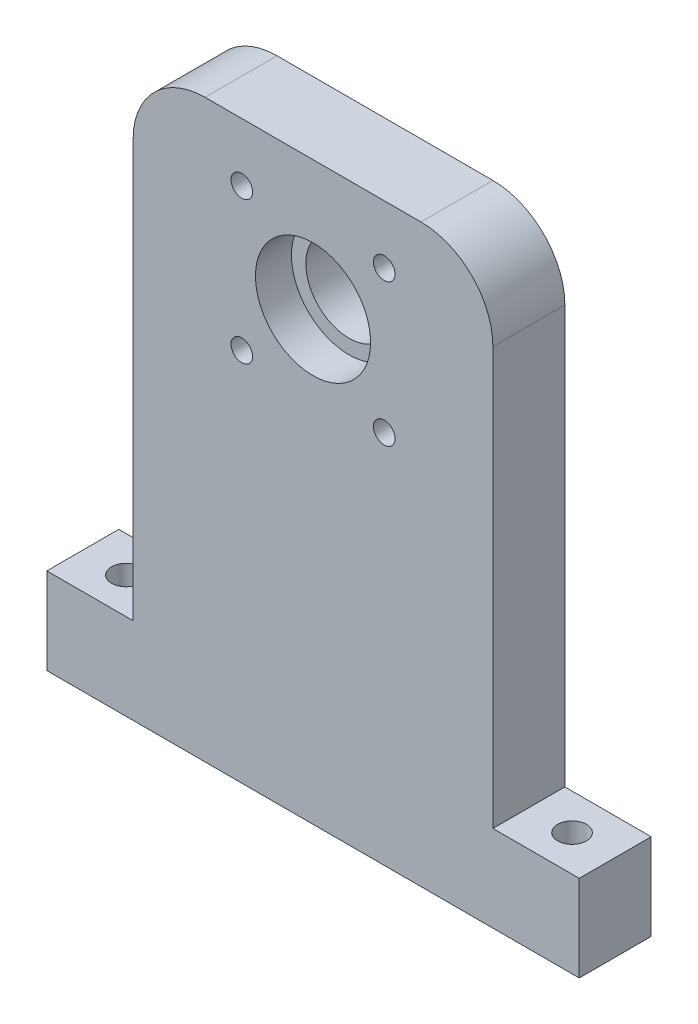
ISO-10303-21;
HEADER;
FILE_DESCRIPTION(('STEP AP214'),'2;1');
FILE_NAME('part.step','',(''),(''),'','','');
FILE_SCHEMA(('AUTOMOTIVE_DESIGN { 1 0 10303 214 1 1 1 1 }'));
ENDSEC;
DATA;
#1=APPLICATION_CONTEXT('core data for automotive mechanical design processes');
#2=APPLICATION_PROTOCOL_DEFINITION('international standard','automotive_design',2000,#1);
#3=PRODUCT_CONTEXT('',#1,'mechanical');
#4=PRODUCT('Part','Part','',(#3));
#5=PRODUCT_RELATED_PRODUCT_CATEGORY('part','',(#4));
#6=PRODUCT_DEFINITION_FORMATION('','',#4);
#7=PRODUCT_DEFINITION_CONTEXT('part definition',#1,'design');
#8=PRODUCT_DEFINITION('design','',#6,#7);
#9=PRODUCT_DEFINITION_SHAPE('','',#8);
#10=(LENGTH_UNIT() NAMED_UNIT(*) SI_UNIT(.MILLI.,.METRE.));
#11=(NAMED_UNIT(*) PLANE_ANGLE_UNIT() SI_UNIT($,.RADIAN.));
#12=(NAMED_UNIT(*) SI_UNIT($,.STERADIAN.) SOLID_ANGLE_UNIT());
#13=UNCERTAINTY_MEASURE_WITH_UNIT(LENGTH_MEASURE(1.E-05),#10,'distance_accuracy_value','');
#14=(GEOMETRIC_REPRESENTATION_CONTEXT(3) GLOBAL_UNCERTAINTY_ASSIGNED_CONTEXT((#13)) GLOBAL_UNIT_ASSIGNED_CONTEXT((#10,
#11,#12)) REPRESENTATION_CONTEXT('',''));
#15=CARTESIAN_POINT('',(0.,0.,0.));
#16=DIRECTION('',(0.,0.,1.));
#17=DIRECTION('',(1.,0.,0.));
#18=AXIS2_PLACEMENT_3D('',#15,#16,#17);
#19=CARTESIAN_POINT('',(24.3750000000001,56.,10.));
#20=DIRECTION('',(0.,-1.,0.));
#21=DIRECTION('',(1.,0.,0.));
#22=AXIS2_PLACEMENT_3D('',#19,#20,#21);
#23=PLANE('',#22);
#24=DIRECTION('',(-1.,0.,0.));
#25=VECTOR('',#24,1.);
#26=CARTESIAN_POINT('',(24.3750000000001,56.,0.));
#27=LINE('',#26,#25);
#28=CARTESIAN_POINT('',(14.3750000000001,56.,0.));
#29=VERTEX_POINT('',#28);
#30=CARTESIAN_POINT('',(-15.6249999999999,56.,0.));
#31=VERTEX_POINT('',#30);
#32=EDGE_CURVE('E151',#29,#31,#27,.T.);
#33=ORIENTED_EDGE('',*,*,#32,.T.);
#34=DIRECTION('',(0.,0.,-1.));
#35=VECTOR('',#34,1.);
#36=CARTESIAN_POINT('',(-15.6249999999999,56.,10.));
#37=LINE('',#36,#35);
#38=CARTESIAN_POINT('',(-15.6249999999999,56.,10.));
#39=VERTEX_POINT('',#38);
#40=EDGE_CURVE('E55',#31,#39,#37,.F.);
#41=ORIENTED_EDGE('',*,*,#40,.T.);
#42=DIRECTION('',(-1.,0.,0.));
#43=VECTOR('',#42,1.);
#44=CARTESIAN_POINT('',(24.3750000000001,56.,10.));
#45=LINE('',#44,#43);
#46=CARTESIAN_POINT('',(14.3750000000001,56.,10.));
#47=VERTEX_POINT('',#46);
#48=EDGE_CURVE('E122',#47,#39,#45,.T.);
#49=ORIENTED_EDGE('',*,*,#48,.F.);
#50=DIRECTION('',(0.,0.,-1.));
#51=VECTOR('',#50,1.);
#52=CARTESIAN_POINT('',(14.3750000000001,56.,10.));
#53=LINE('',#52,#51);
#54=EDGE_CURVE('E184',#47,#29,#53,.T.);
#55=ORIENTED_EDGE('',*,*,#54,.T.);
#56=EDGE_LOOP('',(#33,#41,#49,#55));
#57=FACE_BOUND('',#56,.T.);
#58=ADVANCED_FACE('F32',(#57),#23,.F.);
#59=CARTESIAN_POINT('',(-25.6249999999999,56.,10.));
#60=DIRECTION('',(1.,0.,0.));
#61=DIRECTION('',(0.,1.,0.));
#62=AXIS2_PLACEMENT_3D('',#59,#60,#61);
#63=PLANE('',#62);
#64=DIRECTION('',(0.,-1.,0.));
#65=VECTOR('',#64,1.);
#66=CARTESIAN_POINT('',(-25.6249999999999,56.,10.));
#67=LINE('',#66,#65);
#68=CARTESIAN_POINT('',(-25.6249999999999,46.,10.));
#69=VERTEX_POINT('',#68);
#70=CARTESIAN_POINT('',(-25.6249999999999,-12.,10.));
#71=VERTEX_POINT('',#70);
#72=EDGE_CURVE('E112',#69,#71,#67,.T.);
#73=ORIENTED_EDGE('',*,*,#72,.F.);
#74=DIRECTION('',(0.,0.,-1.));
#75=VECTOR('',#74,1.);
#76=CARTESIAN_POINT('',(-25.6249999999999,46.,10.));
#77=LINE('',#76,#75);
#78=CARTESIAN_POINT('',(-25.6249999999999,46.,0.));
#79=VERTEX_POINT('',#78);
#80=EDGE_CURVE('E131',#69,#79,#77,.T.);
#81=ORIENTED_EDGE('',*,*,#80,.T.);
#82=DIRECTION('',(0.,-1.,0.));
#83=VECTOR('',#82,1.);
#84=CARTESIAN_POINT('',(-25.6249999999999,56.,0.));
#85=LINE('',#84,#83);
#86=CARTESIAN_POINT('',(-25.6249999999999,-12.,0.));
#87=VERTEX_POINT('',#86);
#88=EDGE_CURVE('E128',#79,#87,#85,.T.);
#89=ORIENTED_EDGE('',*,*,#88,.T.);
#90=DIRECTION('',(0.,0.,-1.));
#91=VECTOR('',#90,1.);
#92=CARTESIAN_POINT('',(-25.6249999999999,-12.,10.));
#93=LINE('',#92,#91);
#94=EDGE_CURVE('E125',#71,#87,#93,.T.);
#95=ORIENTED_EDGE('',*,*,#94,.F.);
#96=EDGE_LOOP('',(#73,#81,#89,#95));
#97=FACE_BOUND('',#96,.T.);
#98=ADVANCED_FACE('F126',(#97),#63,.F.);
#99=CARTESIAN_POINT('',(-25.6249999999999,-12.,10.));
#100=DIRECTION('',(0.,-1.,0.));
#101=DIRECTION('',(1.,0.,0.));
#102=AXIS2_PLACEMENT_3D('',#99,#100,#101);
#103=PLANE('',#102);
#104=CARTESIAN_POINT('',(-31.6249999999999,-12.,5.));
#105=DIRECTION('',(0.,1.,0.));
#106=DIRECTION('',(0.,0.,1.));
#107=AXIS2_PLACEMENT_3D('',#104,#105,#106);
#108=CIRCLE('',#107,2.00000000000001);
#109=CARTESIAN_POINT('',(-31.6249999999999,-12.,7.00000000000001));
#110=VERTEX_POINT('',#109);
#111=EDGE_CURVE('E193',#110,#110,#108,.T.);
#112=ORIENTED_EDGE('',*,*,#111,.F.);
#113=EDGE_LOOP('',(#112));
#114=FACE_BOUND('',#113,.T.);
#115=DIRECTION('',(-1.,0.,0.));
#116=VECTOR('',#115,1.);
#117=CARTESIAN_POINT('',(-25.6249999999999,-12.,0.));
#118=LINE('',#117,#116);
#119=CARTESIAN_POINT('',(-37.6249999999999,-12.,0.));
#120=VERTEX_POINT('',#119);
#121=EDGE_CURVE('E155',#87,#120,#118,.T.);
#122=ORIENTED_EDGE('',*,*,#121,.T.);
#123=DIRECTION('',(0.,0.,-1.));
#124=VECTOR('',#123,1.);
#125=CARTESIAN_POINT('',(-37.6249999999999,-12.,10.));
#126=LINE('',#125,#124);
#127=CARTESIAN_POINT('',(-37.6249999999999,-12.,10.));
#128=VERTEX_POINT('',#127);
#129=EDGE_CURVE('E132',#128,#120,#126,.T.);
#130=ORIENTED_EDGE('',*,*,#129,.F.);
#131=DIRECTION('',(-1.,0.,0.));
#132=VECTOR('',#131,1.);
#133=CARTESIAN_POINT('',(-25.6249999999999,-12.,10.));
#134=LINE('',#133,#132);
#135=EDGE_CURVE('E116',#71,#128,#134,.T.);
#136=ORIENTED_EDGE('',*,*,#135,.F.);
#137=ORIENTED_EDGE('',*,*,#94,.T.);
#138=EDGE_LOOP('',(#122,#130,#136,#137));
#139=FACE_BOUND('',#138,.T.);
#140=ADVANCED_FACE('F134',(#114,#139),#103,.F.);
#141=CARTESIAN_POINT('',(-37.6249999999999,-12.,10.));
#142=DIRECTION('',(1.,0.,0.));
#143=DIRECTION('',(0.,0.,-1.));
#144=AXIS2_PLACEMENT_3D('',#141,#142,#143);
#145=PLANE('',#144);
#146=DIRECTION('',(0.,-1.,0.));
#147=VECTOR('',#146,1.);
#148=CARTESIAN_POINT('',(-37.6249999999999,-12.,0.));
#149=LINE('',#148,#147);
#150=CARTESIAN_POINT('',(-37.6249999999999,-24.,0.));
#151=VERTEX_POINT('',#150);
#152=EDGE_CURVE('E157',#120,#151,#149,.T.);
#153=ORIENTED_EDGE('',*,*,#152,.T.);
#154=DIRECTION('',(0.,0.,-1.));
#155=VECTOR('',#154,1.);
#156=CARTESIAN_POINT('',(-37.6249999999999,-24.,10.));
#157=LINE('',#156,#155);
#158=CARTESIAN_POINT('',(-37.6249999999999,-24.,10.));
#159=VERTEX_POINT('',#158);
#160=EDGE_CURVE('E175',#159,#151,#157,.T.);
#161=ORIENTED_EDGE('',*,*,#160,.F.);
#162=DIRECTION('',(0.,-1.,0.));
#163=VECTOR('',#162,1.);
#164=CARTESIAN_POINT('',(-37.6249999999999,-12.,10.));
#165=LINE('',#164,#163);
#166=EDGE_CURVE('E137',#128,#159,#165,.T.);
#167=ORIENTED_EDGE('',*,*,#166,.F.);
#168=ORIENTED_EDGE('',*,*,#129,.T.);
#169=EDGE_LOOP('',(#153,#161,#167,#168));
#170=FACE_BOUND('',#169,.T.);
#171=ADVANCED_FACE('F225',(#170),#145,.F.);
#172=CARTESIAN_POINT('',(-37.6249999999999,-24.,10.));
#173=DIRECTION('',(0.,1.,0.));
#174=DIRECTION('',(-1.,0.,0.));
#175=AXIS2_PLACEMENT_3D('',#172,#173,#174);
#176=PLANE('',#175);
#177=CARTESIAN_POINT('',(-31.6249999999999,-24.,5.));
#178=DIRECTION('',(0.,1.,0.));
#179=DIRECTION('',(-1.,0.,0.));
#180=AXIS2_PLACEMENT_3D('',#177,#178,#179);
#181=CIRCLE('',#180,2.00000000000001);
#182=CARTESIAN_POINT('',(-33.6249999999999,-24.,5.));
#183=VERTEX_POINT('',#182);
#184=EDGE_CURVE('E190',#183,#183,#181,.T.);
#185=ORIENTED_EDGE('',*,*,#184,.T.);
#186=EDGE_LOOP('',(#185));
#187=FACE_BOUND('',#186,.T.);
#188=CARTESIAN_POINT('',(30.3750000000001,-24.,5.));
#189=DIRECTION('',(0.,1.,0.));
#190=DIRECTION('',(-1.,0.,0.));
#191=AXIS2_PLACEMENT_3D('',#188,#189,#190);
#192=CIRCLE('',#191,2.);
#193=CARTESIAN_POINT('',(28.3750000000001,-24.,5.));
#194=VERTEX_POINT('',#193);
#195=EDGE_CURVE('E197',#194,#194,#192,.T.);
#196=ORIENTED_EDGE('',*,*,#195,.T.);
#197=EDGE_LOOP('',(#196));
#198=FACE_BOUND('',#197,.T.);
#199=DIRECTION('',(1.,0.,0.));
#200=VECTOR('',#199,1.);
#201=CARTESIAN_POINT('',(-37.6249999999999,-24.,0.));
#202=LINE('',#201,#200);
#203=CARTESIAN_POINT('',(36.3750000000001,-24.,0.));
#204=VERTEX_POINT('',#203);
#205=EDGE_CURVE('E159',#151,#204,#202,.T.);
#206=ORIENTED_EDGE('',*,*,#205,.T.);
#207=DIRECTION('',(0.,0.,-1.));
#208=VECTOR('',#207,1.);
#209=CARTESIAN_POINT('',(36.3750000000001,-24.,10.));
#210=LINE('',#209,#208);
#211=CARTESIAN_POINT('',(36.3750000000001,-24.,10.));
#212=VERTEX_POINT('',#211);
#213=EDGE_CURVE('E172',#212,#204,#210,.T.);
#214=ORIENTED_EDGE('',*,*,#213,.F.);
#215=DIRECTION('',(1.,0.,0.));
#216=VECTOR('',#215,1.);
#217=CARTESIAN_POINT('',(-37.6249999999999,-24.,10.));
#218=LINE('',#217,#216);
#219=EDGE_CURVE('E139',#159,#212,#218,.T.);
#220=ORIENTED_EDGE('',*,*,#219,.F.);
#221=ORIENTED_EDGE('',*,*,#160,.T.);
#222=EDGE_LOOP('',(#206,#214,#220,#221));
#223=FACE_BOUND('',#222,.T.);
#224=ADVANCED_FACE('F232',(#187,#198,#223),#176,.F.);
#225=CARTESIAN_POINT('',(36.3750000000001,-24.,10.));
#226=DIRECTION('',(-1.,0.,0.));
#227=DIRECTION('',(0.,0.,1.));
#228=AXIS2_PLACEMENT_3D('',#225,#226,#227);
#229=PLANE('',#228);
#230=DIRECTION('',(0.,1.,0.));
#231=VECTOR('',#230,1.);
#232=CARTESIAN_POINT('',(36.3750000000001,-24.,0.));
#233=LINE('',#232,#231);
#234=CARTESIAN_POINT('',(36.3750000000001,-12.,0.));
#235=VERTEX_POINT('',#234);
#236=EDGE_CURVE('E161',#204,#235,#233,.T.);
#237=ORIENTED_EDGE('',*,*,#236,.T.);
#238=DIRECTION('',(0.,0.,-1.));
#239=VECTOR('',#238,1.);
#240=CARTESIAN_POINT('',(36.3750000000001,-12.,10.));
#241=LINE('',#240,#239);
#242=CARTESIAN_POINT('',(36.3750000000001,-12.,10.));
#243=VERTEX_POINT('',#242);
#244=EDGE_CURVE('E169',#243,#235,#241,.T.);
#245=ORIENTED_EDGE('',*,*,#244,.F.);
#246=DIRECTION('',(0.,1.,0.));
#247=VECTOR('',#246,1.);
#248=CARTESIAN_POINT('',(36.3750000000001,-24.,10.));
#249=LINE('',#248,#247);
#250=EDGE_CURVE('E144',#212,#243,#249,.T.);
#251=ORIENTED_EDGE('',*,*,#250,.F.);
#252=ORIENTED_EDGE('',*,*,#213,.T.);
#253=EDGE_LOOP('',(#237,#245,#251,#252));
#254=FACE_BOUND('',#253,.T.);
#255=ADVANCED_FACE('F235',(#254),#229,.F.);
#256=CARTESIAN_POINT('',(36.3750000000001,-12.,10.));
#257=DIRECTION('',(0.,-1.,0.));
#258=DIRECTION('',(1.,0.,0.));
#259=AXIS2_PLACEMENT_3D('',#256,#257,#258);
#260=PLANE('',#259);
#261=CARTESIAN_POINT('',(30.3750000000001,-12.,5.));
#262=DIRECTION('',(0.,1.,0.));
#263=DIRECTION('',(-1.,0.,0.));
#264=AXIS2_PLACEMENT_3D('',#261,#262,#263);
#265=CIRCLE('',#264,2.);
#266=CARTESIAN_POINT('',(28.3750000000001,-12.,5.));
#267=VERTEX_POINT('',#266);
#268=EDGE_CURVE('E192',#267,#267,#265,.T.);
#269=ORIENTED_EDGE('',*,*,#268,.F.);
#270=EDGE_LOOP('',(#269));
#271=FACE_BOUND('',#270,.T.);
#272=DIRECTION('',(-1.,0.,0.));
#273=VECTOR('',#272,1.);
#274=CARTESIAN_POINT('',(36.3750000000001,-12.,0.));
#275=LINE('',#274,#273);
#276=CARTESIAN_POINT('',(24.3750000000001,-12.,0.));
#277=VERTEX_POINT('',#276);
#278=EDGE_CURVE('E163',#235,#277,#275,.T.);
#279=ORIENTED_EDGE('',*,*,#278,.T.);
#280=DIRECTION('',(0.,0.,-1.));
#281=VECTOR('',#280,1.);
#282=CARTESIAN_POINT('',(24.3750000000001,-12.,10.));
#283=LINE('',#282,#281);
#284=CARTESIAN_POINT('',(24.3750000000001,-12.,10.));
#285=VERTEX_POINT('',#284);
#286=EDGE_CURVE('E150',#285,#277,#283,.T.);
#287=ORIENTED_EDGE('',*,*,#286,.F.);
#288=DIRECTION('',(-1.,0.,0.));
#289=VECTOR('',#288,1.);
#290=CARTESIAN_POINT('',(36.3750000000001,-12.,10.));
#291=LINE('',#290,#289);
#292=EDGE_CURVE('E146',#243,#285,#291,.T.);
#293=ORIENTED_EDGE('',*,*,#292,.F.);
#294=ORIENTED_EDGE('',*,*,#244,.T.);
#295=EDGE_LOOP('',(#279,#287,#293,#294));
#296=FACE_BOUND('',#295,.T.);
#297=ADVANCED_FACE('F240',(#271,#296),#260,.F.);
#298=CARTESIAN_POINT('',(24.3750000000001,-12.,10.));
#299=DIRECTION('',(-1.,0.,0.));
#300=DIRECTION('',(0.,-1.,0.));
#301=AXIS2_PLACEMENT_3D('',#298,#299,#300);
#302=PLANE('',#301);
#303=DIRECTION('',(0.,1.,0.));
#304=VECTOR('',#303,1.);
#305=CARTESIAN_POINT('',(24.3750000000001,-12.,0.));
#306=LINE('',#305,#304);
#307=CARTESIAN_POINT('',(24.3750000000001,46.,0.));
#308=VERTEX_POINT('',#307);
#309=EDGE_CURVE('E165',#277,#308,#306,.T.);
#310=ORIENTED_EDGE('',*,*,#309,.T.);
#311=DIRECTION('',(0.,0.,-1.));
#312=VECTOR('',#311,1.);
#313=CARTESIAN_POINT('',(24.3750000000001,46.,10.));
#314=LINE('',#313,#312);
#315=CARTESIAN_POINT('',(24.3750000000001,46.,10.));
#316=VERTEX_POINT('',#315);
#317=EDGE_CURVE('E11',#308,#316,#314,.F.);
#318=ORIENTED_EDGE('',*,*,#317,.T.);
#319=DIRECTION('',(0.,1.,0.));
#320=VECTOR('',#319,1.);
#321=CARTESIAN_POINT('',(24.3750000000001,-12.,10.));
#322=LINE('',#321,#320);
#323=EDGE_CURVE('E148',#285,#316,#322,.T.);
#324=ORIENTED_EDGE('',*,*,#323,.F.);
#325=ORIENTED_EDGE('',*,*,#286,.T.);
#326=EDGE_LOOP('',(#310,#318,#324,#325));
#327=FACE_BOUND('',#326,.T.);
#328=ADVANCED_FACE('F243',(#327),#302,.F.);
#329=CARTESIAN_POINT('',(0.,0.,10.));
#330=DIRECTION('',(0.,0.,1.));
#331=DIRECTION('',(1.,0.,0.));
#332=AXIS2_PLACEMENT_3D('',#329,#330,#331);
#333=PLANE('',#332);
#334=CARTESIAN_POINT('',(-10.5244949366116,28.1005050633884,10.));
#335=DIRECTION('',(0.,0.,1.));
#336=DIRECTION('',(-1.,0.,0.));
#337=AXIS2_PLACEMENT_3D('',#334,#335,#336);
#338=CIRCLE('',#337,1.5);
#339=CARTESIAN_POINT('',(-12.0244949366116,28.1005050633884,10.));
#340=VERTEX_POINT('',#339);
#341=EDGE_CURVE('E321',#340,#340,#338,.T.);
#342=ORIENTED_EDGE('',*,*,#341,.F.);
#343=EDGE_LOOP('',(#342));
#344=FACE_BOUND('',#343,.T.);
#345=CARTESIAN_POINT('',(9.27449493661185,28.1005050633885,10.));
#346=DIRECTION('',(0.,0.,1.));
#347=DIRECTION('',(0.,-1.,0.));
#348=AXIS2_PLACEMENT_3D('',#345,#346,#347);
#349=CIRCLE('',#348,1.5);
#350=CARTESIAN_POINT('',(9.27449493661187,26.6005050633885,10.));
#351=VERTEX_POINT('',#350);
#352=EDGE_CURVE('E317',#351,#351,#349,.T.);
#353=ORIENTED_EDGE('',*,*,#352,.F.);
#354=EDGE_LOOP('',(#353));
#355=FACE_BOUND('',#354,.T.);
#356=CARTESIAN_POINT('',(-10.5244949366116,47.8994949366117,10.));
#357=DIRECTION('',(0.,0.,1.));
#358=DIRECTION('',(0.,1.,0.));
#359=AXIS2_PLACEMENT_3D('',#356,#357,#358);
#360=CIRCLE('',#359,1.5);
#361=CARTESIAN_POINT('',(-10.5244949366116,49.3994949366117,10.));
#362=VERTEX_POINT('',#361);
#363=EDGE_CURVE('E312',#362,#362,#360,.T.);
#364=ORIENTED_EDGE('',*,*,#363,.F.);
#365=EDGE_LOOP('',(#364));
#366=FACE_BOUND('',#365,.T.);
#367=CARTESIAN_POINT('',(9.27449493661178,47.8994949366117,10.));
#368=DIRECTION('',(0.,0.,1.));
#369=DIRECTION('',(1.,0.,0.));
#370=AXIS2_PLACEMENT_3D('',#367,#368,#369);
#371=CIRCLE('',#370,1.5);
#372=CARTESIAN_POINT('',(10.7744949366118,47.8994949366117,10.));
#373=VERTEX_POINT('',#372);
#374=EDGE_CURVE('E205',#373,#373,#371,.T.);
#375=ORIENTED_EDGE('',*,*,#374,.F.);
#376=EDGE_LOOP('',(#375));
#377=FACE_BOUND('',#376,.T.);
#378=CARTESIAN_POINT('',(-0.624999999999903,38.,10.));
#379=DIRECTION('',(0.,0.,1.));
#380=DIRECTION('',(1.,0.,0.));
#381=AXIS2_PLACEMENT_3D('',#378,#379,#380);
#382=CIRCLE('',#381,8.);
#383=CARTESIAN_POINT('',(7.3750000000001,38.,10.));
#384=VERTEX_POINT('',#383);
#385=EDGE_CURVE('E211',#384,#384,#382,.T.);
#386=ORIENTED_EDGE('',*,*,#385,.F.);
#387=EDGE_LOOP('',(#386));
#388=FACE_BOUND('',#387,.T.);
#389=ORIENTED_EDGE('',*,*,#48,.T.);
#390=CARTESIAN_POINT('',(-15.6249999999999,46.,10.));
#391=DIRECTION('',(0.,0.,1.));
#392=DIRECTION('',(1.,0.,0.));
#393=AXIS2_PLACEMENT_3D('',#390,#391,#392);
#394=CIRCLE('',#393,10.);
#395=EDGE_CURVE('E41',#39,#69,#394,.T.);
#396=ORIENTED_EDGE('',*,*,#395,.T.);
#397=ORIENTED_EDGE('',*,*,#72,.T.);
#398=ORIENTED_EDGE('',*,*,#135,.T.);
#399=ORIENTED_EDGE('',*,*,#166,.T.);
#400=ORIENTED_EDGE('',*,*,#219,.T.);
#401=ORIENTED_EDGE('',*,*,#250,.T.);
#402=ORIENTED_EDGE('',*,*,#292,.T.);
#403=ORIENTED_EDGE('',*,*,#323,.T.);
#404=CARTESIAN_POINT('',(14.3750000000001,46.,10.));
#405=DIRECTION('',(0.,0.,1.));
#406=DIRECTION('',(1.,0.,0.));
#407=AXIS2_PLACEMENT_3D('',#404,#405,#406);
#408=CIRCLE('',#407,10.);
#409=EDGE_CURVE('E188',#316,#47,#408,.T.);
#410=ORIENTED_EDGE('',*,*,#409,.T.);
#411=EDGE_LOOP('',(#389,#396,#397,#398,#399,#400,#401,#402,#403,#410));
#412=FACE_BOUND('',#411,.T.);
#413=ADVANCED_FACE('F114',(#344,#355,#366,#377,#388,#412),#333,.T.);
#414=CARTESIAN_POINT('',(0.,0.,0.));
#415=DIRECTION('',(0.,0.,1.));
#416=DIRECTION('',(1.,0.,0.));
#417=AXIS2_PLACEMENT_3D('',#414,#415,#416);
#418=PLANE('',#417);
#419=CARTESIAN_POINT('',(-0.624999999999903,38.,0.));
#420=DIRECTION('',(0.,0.,1.));
#421=DIRECTION('',(1.,0.,0.));
#422=AXIS2_PLACEMENT_3D('',#419,#420,#421);
#423=CIRCLE('',#422,6.);
#424=CARTESIAN_POINT('',(5.3750000000001,38.,0.));
#425=VERTEX_POINT('',#424);
#426=EDGE_CURVE('E288',#425,#425,#423,.T.);
#427=ORIENTED_EDGE('',*,*,#426,.T.);
#428=EDGE_LOOP('',(#427));
#429=FACE_BOUND('',#428,.T.);
#430=CARTESIAN_POINT('',(-10.5244949366116,28.1005050633884,0.));
#431=DIRECTION('',(0.,0.,1.));
#432=DIRECTION('',(-1.,0.,0.));
#433=AXIS2_PLACEMENT_3D('',#430,#431,#432);
#434=CIRCLE('',#433,1.5);
#435=CARTESIAN_POINT('',(-12.0244949366116,28.1005050633884,0.));
#436=VERTEX_POINT('',#435);
#437=EDGE_CURVE('E292',#436,#436,#434,.T.);
#438=ORIENTED_EDGE('',*,*,#437,.T.);
#439=EDGE_LOOP('',(#438));
#440=FACE_BOUND('',#439,.T.);
#441=CARTESIAN_POINT('',(9.27449493661185,28.1005050633885,0.));
#442=DIRECTION('',(0.,0.,1.));
#443=DIRECTION('',(0.,-1.,0.));
#444=AXIS2_PLACEMENT_3D('',#441,#442,#443);
#445=CIRCLE('',#444,1.5);
#446=CARTESIAN_POINT('',(9.27449493661187,26.6005050633885,0.));
#447=VERTEX_POINT('',#446);
#448=EDGE_CURVE('E296',#447,#447,#445,.T.);
#449=ORIENTED_EDGE('',*,*,#448,.T.);
#450=EDGE_LOOP('',(#449));
#451=FACE_BOUND('',#450,.T.);
#452=CARTESIAN_POINT('',(-10.5244949366116,47.8994949366117,0.));
#453=DIRECTION('',(0.,0.,1.));
#454=DIRECTION('',(0.,1.,0.));
#455=AXIS2_PLACEMENT_3D('',#452,#453,#454);
#456=CIRCLE('',#455,1.5);
#457=CARTESIAN_POINT('',(-10.5244949366116,49.3994949366117,0.));
#458=VERTEX_POINT('',#457);
#459=EDGE_CURVE('E300',#458,#458,#456,.T.);
#460=ORIENTED_EDGE('',*,*,#459,.T.);
#461=EDGE_LOOP('',(#460));
#462=FACE_BOUND('',#461,.T.);
#463=CARTESIAN_POINT('',(9.27449493661178,47.8994949366117,0.));
#464=DIRECTION('',(0.,0.,1.));
#465=DIRECTION('',(1.,0.,0.));
#466=AXIS2_PLACEMENT_3D('',#463,#464,#465);
#467=CIRCLE('',#466,1.5);
#468=CARTESIAN_POINT('',(10.7744949366118,47.8994949366117,0.));
#469=VERTEX_POINT('',#468);
#470=EDGE_CURVE('E200',#469,#469,#467,.T.);
#471=ORIENTED_EDGE('',*,*,#470,.T.);
#472=EDGE_LOOP('',(#471));
#473=FACE_BOUND('',#472,.T.);
#474=ORIENTED_EDGE('',*,*,#88,.F.);
#475=CARTESIAN_POINT('',(-15.6249999999999,46.,0.));
#476=DIRECTION('',(0.,0.,1.));
#477=DIRECTION('',(1.,0.,0.));
#478=AXIS2_PLACEMENT_3D('',#475,#476,#477);
#479=CIRCLE('',#478,10.);
#480=EDGE_CURVE('E182',#79,#31,#479,.F.);
#481=ORIENTED_EDGE('',*,*,#480,.T.);
#482=ORIENTED_EDGE('',*,*,#32,.F.);
#483=CARTESIAN_POINT('',(14.3750000000001,46.,0.));
#484=DIRECTION('',(0.,0.,1.));
#485=DIRECTION('',(1.,0.,0.));
#486=AXIS2_PLACEMENT_3D('',#483,#484,#485);
#487=CIRCLE('',#486,10.);
#488=EDGE_CURVE('E180',#29,#308,#487,.F.);
#489=ORIENTED_EDGE('',*,*,#488,.T.);
#490=ORIENTED_EDGE('',*,*,#309,.F.);
#491=ORIENTED_EDGE('',*,*,#278,.F.);
#492=ORIENTED_EDGE('',*,*,#236,.F.);
#493=ORIENTED_EDGE('',*,*,#205,.F.);
#494=ORIENTED_EDGE('',*,*,#152,.F.);
#495=ORIENTED_EDGE('',*,*,#121,.F.);
#496=EDGE_LOOP('',(#474,#481,#482,#489,#490,#491,#492,#493,#494,#495));
#497=FACE_BOUND('',#496,.T.);
#498=ADVANCED_FACE('F220',(#429,#440,#451,#462,#473,#497),#418,.F.);
#499=CARTESIAN_POINT('',(-0.624999999999903,38.,5.));
#500=DIRECTION('',(0.,0.,1.));
#501=DIRECTION('',(1.,0.,0.));
#502=AXIS2_PLACEMENT_3D('',#499,#500,#501);
#503=CYLINDRICAL_SURFACE('',#502,8.);
#504=CARTESIAN_POINT('',(-0.624999999999903,38.,5.));
#505=DIRECTION('',(0.,0.,1.));
#506=DIRECTION('',(1.,0.,0.));
#507=AXIS2_PLACEMENT_3D('',#504,#505,#506);
#508=CIRCLE('',#507,8.);
#509=CARTESIAN_POINT('',(7.3750000000001,38.,5.));
#510=VERTEX_POINT('',#509);
#511=EDGE_CURVE('E153',#510,#510,#508,.T.);
#512=ORIENTED_EDGE('',*,*,#511,.F.);
#513=EDGE_LOOP('',(#512));
#514=FACE_BOUND('',#513,.T.);
#515=ORIENTED_EDGE('',*,*,#385,.T.);
#516=EDGE_LOOP('',(#515));
#517=FACE_BOUND('',#516,.T.);
#518=ADVANCED_FACE('F269',(#514,#517),#503,.F.);
#519=CARTESIAN_POINT('',(-0.624999999999903,38.,5.));
#520=DIRECTION('',(0.,0.,1.));
#521=DIRECTION('',(1.,0.,0.));
#522=AXIS2_PLACEMENT_3D('',#519,#520,#521);
#523=PLANE('',#522);
#524=CARTESIAN_POINT('',(-0.624999999999903,38.,5.));
#525=DIRECTION('',(0.,0.,1.));
#526=DIRECTION('',(1.,0.,0.));
#527=AXIS2_PLACEMENT_3D('',#524,#525,#526);
#528=CIRCLE('',#527,6.);
#529=CARTESIAN_POINT('',(5.3750000000001,38.,5.));
#530=VERTEX_POINT('',#529);
#531=EDGE_CURVE('E36',#530,#530,#528,.T.);
#532=ORIENTED_EDGE('',*,*,#531,.F.);
#533=EDGE_LOOP('',(#532));
#534=FACE_BOUND('',#533,.T.);
#535=ORIENTED_EDGE('',*,*,#511,.T.);
#536=EDGE_LOOP('',(#535));
#537=FACE_BOUND('',#536,.T.);
#538=ADVANCED_FACE('F263',(#534,#537),#523,.T.);
#539=CARTESIAN_POINT('',(-15.6249999999999,46.,10.));
#540=DIRECTION('',(0.,0.,-1.));
#541=DIRECTION('',(-1.,0.,0.));
#542=AXIS2_PLACEMENT_3D('',#539,#540,#541);
#543=CYLINDRICAL_SURFACE('',#542,10.);
#544=ORIENTED_EDGE('',*,*,#395,.F.);
#545=ORIENTED_EDGE('',*,*,#40,.F.);
#546=ORIENTED_EDGE('',*,*,#480,.F.);
#547=ORIENTED_EDGE('',*,*,#80,.F.);
#548=EDGE_LOOP('',(#544,#545,#546,#547));
#549=FACE_BOUND('',#548,.T.);
#550=ADVANCED_FACE('F218',(#549),#543,.T.);
#551=CARTESIAN_POINT('',(14.3750000000001,46.,10.));
#552=DIRECTION('',(0.,0.,-1.));
#553=DIRECTION('',(-1.,0.,0.));
#554=AXIS2_PLACEMENT_3D('',#551,#552,#553);
#555=CYLINDRICAL_SURFACE('',#554,10.);
#556=ORIENTED_EDGE('',*,*,#409,.F.);
#557=ORIENTED_EDGE('',*,*,#317,.F.);
#558=ORIENTED_EDGE('',*,*,#488,.F.);
#559=ORIENTED_EDGE('',*,*,#54,.F.);
#560=EDGE_LOOP('',(#556,#557,#558,#559));
#561=FACE_BOUND('',#560,.T.);
#562=ADVANCED_FACE('F34',(#561),#555,.T.);
#563=CARTESIAN_POINT('',(30.3750000000001,-33.,5.));
#564=DIRECTION('',(0.,1.,0.));
#565=DIRECTION('',(-1.,0.,0.));
#566=AXIS2_PLACEMENT_3D('',#563,#564,#565);
#567=CYLINDRICAL_SURFACE('',#566,2.);
#568=CARTESIAN_POINT('',(28.3750000000001,-12.,5.));
#569=CARTESIAN_POINT('',(28.3750000000001,-12.125,5.));
#570=CARTESIAN_POINT('',(28.3750000000001,-12.25,5.));
#571=CARTESIAN_POINT('',(28.3750000000001,-12.5,5.));
#572=CARTESIAN_POINT('',(28.3750000000001,-12.625,5.));
#573=CARTESIAN_POINT('',(28.3750000000001,-12.875,5.));
#574=CARTESIAN_POINT('',(28.3750000000001,-13.,5.));
#575=CARTESIAN_POINT('',(28.3750000000001,-13.25,5.));
#576=CARTESIAN_POINT('',(28.3750000000001,-13.375,5.));
#577=CARTESIAN_POINT('',(28.3750000000001,-13.625,5.));
#578=CARTESIAN_POINT('',(28.3750000000001,-13.75,5.));
#579=CARTESIAN_POINT('',(28.3750000000001,-14.,5.));
#580=CARTESIAN_POINT('',(28.3750000000001,-14.125,5.));
#581=CARTESIAN_POINT('',(28.3750000000001,-14.375,5.));
#582=CARTESIAN_POINT('',(28.3750000000001,-14.5,5.));
#583=CARTESIAN_POINT('',(28.3750000000001,-14.75,5.));
#584=CARTESIAN_POINT('',(28.3750000000001,-14.875,5.));
#585=CARTESIAN_POINT('',(28.3750000000001,-15.125,5.));
#586=CARTESIAN_POINT('',(28.3750000000001,-15.25,5.));
#587=CARTESIAN_POINT('',(28.3750000000001,-15.5,5.));
#588=CARTESIAN_POINT('',(28.3750000000001,-15.625,5.));
#589=CARTESIAN_POINT('',(28.3750000000001,-15.875,5.));
#590=CARTESIAN_POINT('',(28.3750000000001,-16.,5.));
#591=CARTESIAN_POINT('',(28.3750000000001,-16.25,5.));
#592=CARTESIAN_POINT('',(28.3750000000001,-16.375,5.));
#593=CARTESIAN_POINT('',(28.3750000000001,-16.625,5.));
#594=CARTESIAN_POINT('',(28.3750000000001,-16.75,5.));
#595=CARTESIAN_POINT('',(28.3750000000001,-17.,5.));
#596=CARTESIAN_POINT('',(28.3750000000001,-17.125,5.));
#597=CARTESIAN_POINT('',(28.3750000000001,-17.375,5.));
#598=CARTESIAN_POINT('',(28.3750000000001,-17.5,5.));
#599=CARTESIAN_POINT('',(28.3750000000001,-17.75,5.));
#600=CARTESIAN_POINT('',(28.3750000000001,-17.875,5.));
#601=CARTESIAN_POINT('',(28.3750000000001,-18.125,5.));
#602=CARTESIAN_POINT('',(28.3750000000001,-18.25,5.));
#603=CARTESIAN_POINT('',(28.3750000000001,-18.5,5.));
#604=CARTESIAN_POINT('',(28.3750000000001,-18.625,5.));
#605=CARTESIAN_POINT('',(28.3750000000001,-18.875,5.));
#606=CARTESIAN_POINT('',(28.3750000000001,-19.,5.));
#607=CARTESIAN_POINT('',(28.3750000000001,-19.25,5.));
#608=CARTESIAN_POINT('',(28.3750000000001,-19.375,5.));
#609=CARTESIAN_POINT('',(28.3750000000001,-19.625,5.));
#610=CARTESIAN_POINT('',(28.3750000000001,-19.75,5.));
#611=CARTESIAN_POINT('',(28.3750000000001,-20.,5.));
#612=CARTESIAN_POINT('',(28.3750000000001,-20.125,5.));
#613=CARTESIAN_POINT('',(28.3750000000001,-20.375,5.));
#614=CARTESIAN_POINT('',(28.3750000000001,-20.5,5.));
#615=CARTESIAN_POINT('',(28.3750000000001,-20.75,5.));
#616=CARTESIAN_POINT('',(28.3750000000001,-20.875,5.));
#617=CARTESIAN_POINT('',(28.3750000000001,-21.125,5.));
#618=CARTESIAN_POINT('',(28.3750000000001,-21.25,5.));
#619=CARTESIAN_POINT('',(28.3750000000001,-21.5,5.));
#620=CARTESIAN_POINT('',(28.3750000000001,-21.625,5.));
#621=CARTESIAN_POINT('',(28.3750000000001,-21.875,5.));
#622=CARTESIAN_POINT('',(28.3750000000001,-22.,5.));
#623=CARTESIAN_POINT('',(28.3750000000001,-22.25,5.));
#624=CARTESIAN_POINT('',(28.3750000000001,-22.375,5.));
#625=CARTESIAN_POINT('',(28.3750000000001,-22.625,5.));
#626=CARTESIAN_POINT('',(28.3750000000001,-22.75,5.));
#627=CARTESIAN_POINT('',(28.3750000000001,-23.,5.));
#628=CARTESIAN_POINT('',(28.3750000000001,-23.125,5.));
#629=CARTESIAN_POINT('',(28.3750000000001,-23.375,5.));
#630=CARTESIAN_POINT('',(28.3750000000001,-23.5,5.));
#631=CARTESIAN_POINT('',(28.3750000000001,-23.75,5.));
#632=CARTESIAN_POINT('',(28.3750000000001,-23.875,5.));
#633=CARTESIAN_POINT('',(28.3750000000001,-24.,5.));
#634=B_SPLINE_CURVE_WITH_KNOTS('',3,(#568,#569,#570,#571,#572,#573,#574,#575,#576,#577,#578,
#579,#580,#581,#582,#583,#584,#585,#586,#587,#588,#589,#590,#591,#592,#593,#594,#595,#596,#597,
#598,#599,#600,#601,#602,#603,#604,#605,#606,#607,#608,#609,#610,#611,#612,#613,#614,#615,#616,
#617,#618,#619,#620,#621,#622,#623,#624,#625,#626,#627,#628,#629,#630,#631,#632,#633),
.UNSPECIFIED.,.F.,.F.,(4,2,2,2,2,2,2,2,2,2,2,2,2,2,2,2,2,2,2,2,2,2,2,2,2,2,2,2,2,2,2,2,4),(0.,
0.375,0.750000000000001,1.125,1.5,1.875,2.25,2.625,3.,3.375,3.75,4.125,4.5,4.875,5.25,5.625,6.,
6.375,6.75,7.125,7.5,7.875,8.25,8.625,9.,9.375,9.75,10.125,10.5,10.875,11.25,11.625,12.),.UNSPECIFIED.);
#635=EDGE_CURVE('BSEAM268',#267,#194,#634,.T.);
#636=ORIENTED_EDGE('',*,*,#268,.T.);
#637=ORIENTED_EDGE('',*,*,#195,.F.);
#638=ORIENTED_EDGE('',*,*,#635,.T.);
#639=ORIENTED_EDGE('',*,*,#635,.F.);
#640=EDGE_LOOP('',(#636,#638,#637,#639));
#641=FACE_BOUND('',#640,.T.);
#642=ADVANCED_FACE('F268',(#641),#567,.F.);
#643=CARTESIAN_POINT('',(-31.6249999999999,-37.,5.));
#644=DIRECTION('',(0.,1.,0.));
#645=DIRECTION('',(0.,0.,1.));
#646=AXIS2_PLACEMENT_3D('',#643,#644,#645);
#647=CYLINDRICAL_SURFACE('',#646,2.00000000000001);
#648=ORIENTED_EDGE('',*,*,#111,.T.);
#649=EDGE_LOOP('',(#648));
#650=FACE_BOUND('',#649,.T.);
#651=ORIENTED_EDGE('',*,*,#184,.F.);
#652=EDGE_LOOP('',(#651));
#653=FACE_BOUND('',#652,.T.);
#654=ADVANCED_FACE('F307',(#650,#653),#647,.F.);
#655=CARTESIAN_POINT('',(9.27449493661178,47.8994949366117,0.));
#656=DIRECTION('',(0.,0.,1.));
#657=DIRECTION('',(1.,0.,0.));
#658=AXIS2_PLACEMENT_3D('',#655,#656,#657);
#659=CYLINDRICAL_SURFACE('',#658,1.5);
#660=ORIENTED_EDGE('',*,*,#470,.F.);
#661=EDGE_LOOP('',(#660));
#662=FACE_BOUND('',#661,.T.);
#663=ORIENTED_EDGE('',*,*,#374,.T.);
#664=EDGE_LOOP('',(#663));
#665=FACE_BOUND('',#664,.T.);
#666=ADVANCED_FACE('F303',(#662,#665),#659,.F.);
#667=CARTESIAN_POINT('',(-10.5244949366116,47.8994949366117,0.));
#668=DIRECTION('',(0.,0.,1.));
#669=DIRECTION('',(1.,0.,0.));
#670=AXIS2_PLACEMENT_3D('',#667,#668,#669);
#671=CYLINDRICAL_SURFACE('',#670,1.5);
#672=ORIENTED_EDGE('',*,*,#459,.F.);
#673=EDGE_LOOP('',(#672));
#674=FACE_BOUND('',#673,.T.);
#675=ORIENTED_EDGE('',*,*,#363,.T.);
#676=EDGE_LOOP('',(#675));
#677=FACE_BOUND('',#676,.T.);
#678=ADVANCED_FACE('F306',(#674,#677),#671,.F.);
#679=CARTESIAN_POINT('',(9.27449493661185,28.1005050633885,0.));
#680=DIRECTION('',(0.,0.,1.));
#681=DIRECTION('',(1.,0.,0.));
#682=AXIS2_PLACEMENT_3D('',#679,#680,#681);
#683=CYLINDRICAL_SURFACE('',#682,1.5);
#684=ORIENTED_EDGE('',*,*,#448,.F.);
#685=EDGE_LOOP('',(#684));
#686=FACE_BOUND('',#685,.T.);
#687=ORIENTED_EDGE('',*,*,#352,.T.);
#688=EDGE_LOOP('',(#687));
#689=FACE_BOUND('',#688,.T.);
#690=ADVANCED_FACE('F335',(#686,#689),#683,.F.);
#691=CARTESIAN_POINT('',(-10.5244949366116,28.1005050633884,0.));
#692=DIRECTION('',(0.,0.,1.));
#693=DIRECTION('',(1.,0.,0.));
#694=AXIS2_PLACEMENT_3D('',#691,#692,#693);
#695=CYLINDRICAL_SURFACE('',#694,1.5);
#696=ORIENTED_EDGE('',*,*,#437,.F.);
#697=EDGE_LOOP('',(#696));
#698=FACE_BOUND('',#697,.T.);
#699=ORIENTED_EDGE('',*,*,#341,.T.);
#700=EDGE_LOOP('',(#699));
#701=FACE_BOUND('',#700,.T.);
#702=ADVANCED_FACE('F330',(#698,#701),#695,.F.);
#703=CARTESIAN_POINT('',(-0.624999999999903,38.,0.));
#704=DIRECTION('',(0.,0.,1.));
#705=DIRECTION('',(1.,0.,0.));
#706=AXIS2_PLACEMENT_3D('',#703,#704,#705);
#707=CYLINDRICAL_SURFACE('',#706,6.);
#708=ORIENTED_EDGE('',*,*,#531,.T.);
#709=EDGE_LOOP('',(#708));
#710=FACE_BOUND('',#709,.T.);
#711=ORIENTED_EDGE('',*,*,#426,.F.);
#712=EDGE_LOOP('',(#711));
#713=FACE_BOUND('',#712,.T.);
#714=ADVANCED_FACE('F327',(#710,#713),#707,.F.);
#715=CLOSED_SHELL('',(#58,#98,#140,#171,#224,#255,#297,#328,#413,#498,#518,#538,#550,#562,#642,
#654,#666,#678,#690,#702,#714));
#716=MANIFOLD_SOLID_BREP('B2',#715);
#717=ADVANCED_BREP_SHAPE_REPRESENTATION('',(#18,#716),#14);
#718=SHAPE_DEFINITION_REPRESENTATION(#9,#717);
ENDSEC;
END-ISO-10303-21;
